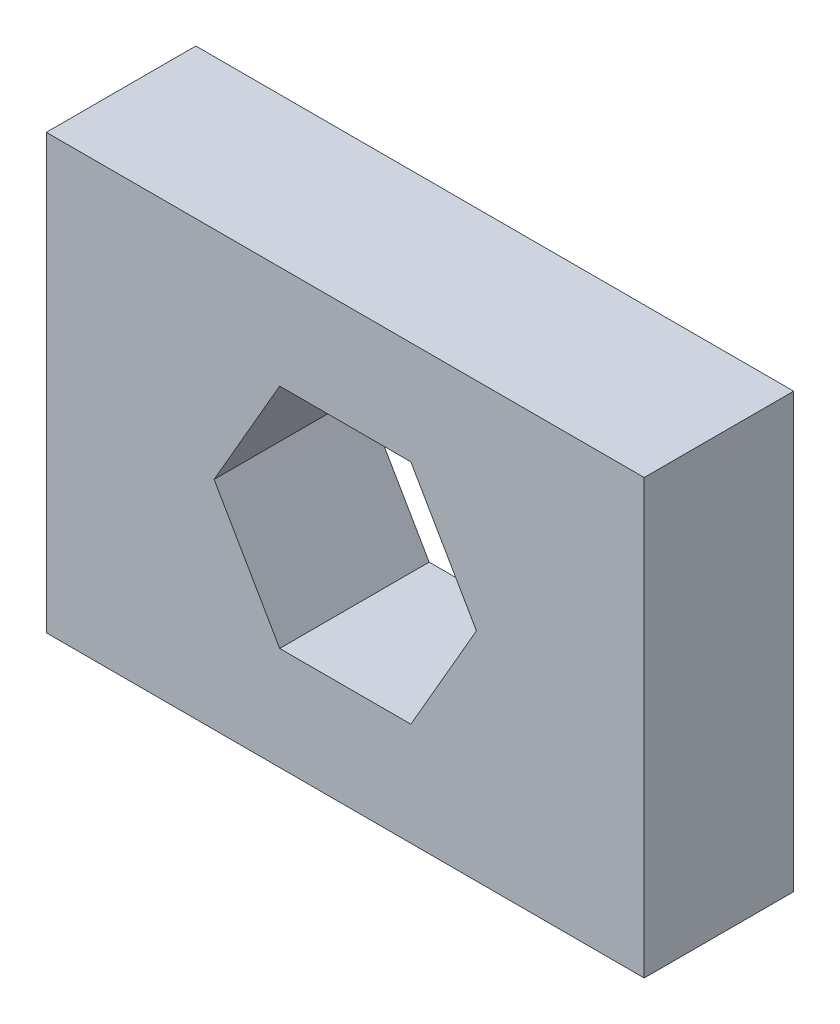
ISO-10303-21;
HEADER;
FILE_DESCRIPTION(('STEP AP214'),'2;1');
FILE_NAME('part.step','',(''),(''),'','','');
FILE_SCHEMA(('AUTOMOTIVE_DESIGN { 1 0 10303 214 1 1 1 1 }'));
ENDSEC;
DATA;
#1=APPLICATION_CONTEXT('core data for automotive mechanical design processes');
#2=APPLICATION_PROTOCOL_DEFINITION('international standard','automotive_design',2000,#1);
#3=PRODUCT_CONTEXT('',#1,'mechanical');
#4=PRODUCT('Part','Part','',(#3));
#5=PRODUCT_RELATED_PRODUCT_CATEGORY('part','',(#4));
#6=PRODUCT_DEFINITION_FORMATION('','',#4);
#7=PRODUCT_DEFINITION_CONTEXT('part definition',#1,'design');
#8=PRODUCT_DEFINITION('design','',#6,#7);
#9=PRODUCT_DEFINITION_SHAPE('','',#8);
#10=(LENGTH_UNIT() NAMED_UNIT(*) SI_UNIT(.MILLI.,.METRE.));
#11=(NAMED_UNIT(*) PLANE_ANGLE_UNIT() SI_UNIT($,.RADIAN.));
#12=(NAMED_UNIT(*) SI_UNIT($,.STERADIAN.) SOLID_ANGLE_UNIT());
#13=UNCERTAINTY_MEASURE_WITH_UNIT(LENGTH_MEASURE(1.E-05),#10,'distance_accuracy_value','');
#14=(GEOMETRIC_REPRESENTATION_CONTEXT(3) GLOBAL_UNCERTAINTY_ASSIGNED_CONTEXT((#13)) GLOBAL_UNIT_ASSIGNED_CONTEXT((#10,
#11,#12)) REPRESENTATION_CONTEXT('',''));
#15=CARTESIAN_POINT('',(0.,0.,0.));
#16=DIRECTION('',(0.,0.,1.));
#17=DIRECTION('',(1.,0.,0.));
#18=AXIS2_PLACEMENT_3D('',#15,#16,#17);
#19=CARTESIAN_POINT('',(0.,0.,5.));
#20=DIRECTION('',(0.,0.,-1.));
#21=DIRECTION('',(-1.,0.,0.));
#22=AXIS2_PLACEMENT_3D('',#19,#20,#21);
#23=PLANE('',#22);
#24=DIRECTION('',(0.,-1.,0.));
#25=VECTOR('',#24,1.);
#26=CARTESIAN_POINT('',(0.,0.,5.));
#27=LINE('',#26,#25);
#28=CARTESIAN_POINT('',(0.,14.5,5.));
#29=VERTEX_POINT('',#28);
#30=CARTESIAN_POINT('',(0.,0.,5.));
#31=VERTEX_POINT('',#30);
#32=EDGE_CURVE('E161',#29,#31,#27,.T.);
#33=ORIENTED_EDGE('',*,*,#32,.T.);
#34=DIRECTION('',(1.,0.,0.));
#35=VECTOR('',#34,1.);
#36=CARTESIAN_POINT('',(0.,0.,5.));
#37=LINE('',#36,#35);
#38=CARTESIAN_POINT('',(20.,0.,5.));
#39=VERTEX_POINT('',#38);
#40=EDGE_CURVE('E164',#31,#39,#37,.T.);
#41=ORIENTED_EDGE('',*,*,#40,.T.);
#42=DIRECTION('',(0.,1.,0.));
#43=VECTOR('',#42,1.);
#44=CARTESIAN_POINT('',(20.,0.,5.));
#45=LINE('',#44,#43);
#46=CARTESIAN_POINT('',(20.,14.5,5.));
#47=VERTEX_POINT('',#46);
#48=EDGE_CURVE('E167',#39,#47,#45,.T.);
#49=ORIENTED_EDGE('',*,*,#48,.T.);
#50=DIRECTION('',(-1.,0.,0.));
#51=VECTOR('',#50,1.);
#52=CARTESIAN_POINT('',(0.,14.5,5.));
#53=LINE('',#52,#51);
#54=EDGE_CURVE('E169',#47,#29,#53,.T.);
#55=ORIENTED_EDGE('',*,*,#54,.T.);
#56=EDGE_LOOP('',(#33,#41,#49,#55));
#57=FACE_BOUND('',#56,.T.);
#58=DIRECTION('',(0.5,0.866025403784439,0.));
#59=VECTOR('',#58,1.);
#60=CARTESIAN_POINT('',(12.1939310229206,3.45,5.));
#61=LINE('',#60,#59);
#62=CARTESIAN_POINT('',(12.1939310229206,3.45,5.));
#63=VERTEX_POINT('',#62);
#64=CARTESIAN_POINT('',(14.3878620458412,7.25,5.));
#65=VERTEX_POINT('',#64);
#66=EDGE_CURVE('E110',#63,#65,#61,.T.);
#67=ORIENTED_EDGE('',*,*,#66,.F.);
#68=DIRECTION('',(1.,0.,0.));
#69=VECTOR('',#68,1.);
#70=CARTESIAN_POINT('',(7.80606897707942,3.45,5.));
#71=LINE('',#70,#69);
#72=CARTESIAN_POINT('',(7.80606897707942,3.45,5.));
#73=VERTEX_POINT('',#72);
#74=EDGE_CURVE('E139',#73,#63,#71,.T.);
#75=ORIENTED_EDGE('',*,*,#74,.F.);
#76=DIRECTION('',(0.5,-0.866025403784439,0.));
#77=VECTOR('',#76,1.);
#78=CARTESIAN_POINT('',(5.61213795415884,7.25,5.));
#79=LINE('',#78,#77);
#80=CARTESIAN_POINT('',(5.61213795415884,7.25,5.));
#81=VERTEX_POINT('',#80);
#82=EDGE_CURVE('E137',#81,#73,#79,.T.);
#83=ORIENTED_EDGE('',*,*,#82,.F.);
#84=DIRECTION('',(-0.5,-0.866025403784439,0.));
#85=VECTOR('',#84,1.);
#86=CARTESIAN_POINT('',(7.80606897707942,11.05,5.));
#87=LINE('',#86,#85);
#88=CARTESIAN_POINT('',(7.80606897707942,11.05,5.));
#89=VERTEX_POINT('',#88);
#90=EDGE_CURVE('E133',#89,#81,#87,.T.);
#91=ORIENTED_EDGE('',*,*,#90,.F.);
#92=DIRECTION('',(-1.,0.,0.));
#93=VECTOR('',#92,1.);
#94=CARTESIAN_POINT('',(12.1939310229206,11.05,5.));
#95=LINE('',#94,#93);
#96=CARTESIAN_POINT('',(12.1939310229206,11.05,5.));
#97=VERTEX_POINT('',#96);
#98=EDGE_CURVE('E131',#97,#89,#95,.T.);
#99=ORIENTED_EDGE('',*,*,#98,.F.);
#100=DIRECTION('',(-0.5,0.866025403784439,0.));
#101=VECTOR('',#100,1.);
#102=CARTESIAN_POINT('',(14.3878620458412,7.25,5.));
#103=LINE('',#102,#101);
#104=EDGE_CURVE('E118',#65,#97,#103,.T.);
#105=ORIENTED_EDGE('',*,*,#104,.F.);
#106=EDGE_LOOP('',(#67,#75,#83,#91,#99,#105));
#107=FACE_BOUND('',#106,.T.);
#108=ADVANCED_FACE('F33',(#57,#107),#23,.F.);
#109=CARTESIAN_POINT('',(0.,0.,0.));
#110=DIRECTION('',(0.,0.,-1.));
#111=DIRECTION('',(-1.,0.,0.));
#112=AXIS2_PLACEMENT_3D('',#109,#110,#111);
#113=PLANE('',#112);
#114=DIRECTION('',(0.,-1.,0.));
#115=VECTOR('',#114,1.);
#116=CARTESIAN_POINT('',(0.,0.,0.));
#117=LINE('',#116,#115);
#118=CARTESIAN_POINT('',(0.,14.5,0.));
#119=VERTEX_POINT('',#118);
#120=CARTESIAN_POINT('',(0.,0.,0.));
#121=VERTEX_POINT('',#120);
#122=EDGE_CURVE('E126',#119,#121,#117,.T.);
#123=ORIENTED_EDGE('',*,*,#122,.F.);
#124=DIRECTION('',(-1.,0.,0.));
#125=VECTOR('',#124,1.);
#126=CARTESIAN_POINT('',(0.,14.5,0.));
#127=LINE('',#126,#125);
#128=CARTESIAN_POINT('',(20.,14.5,0.));
#129=VERTEX_POINT('',#128);
#130=EDGE_CURVE('E165',#129,#119,#127,.T.);
#131=ORIENTED_EDGE('',*,*,#130,.F.);
#132=DIRECTION('',(0.,1.,0.));
#133=VECTOR('',#132,1.);
#134=CARTESIAN_POINT('',(20.,0.,0.));
#135=LINE('',#134,#133);
#136=CARTESIAN_POINT('',(20.,0.,0.));
#137=VERTEX_POINT('',#136);
#138=EDGE_CURVE('E176',#137,#129,#135,.T.);
#139=ORIENTED_EDGE('',*,*,#138,.F.);
#140=DIRECTION('',(1.,0.,0.));
#141=VECTOR('',#140,1.);
#142=CARTESIAN_POINT('',(0.,0.,0.));
#143=LINE('',#142,#141);
#144=EDGE_CURVE('E174',#121,#137,#143,.T.);
#145=ORIENTED_EDGE('',*,*,#144,.F.);
#146=EDGE_LOOP('',(#123,#131,#139,#145));
#147=FACE_BOUND('',#146,.T.);
#148=DIRECTION('',(1.,0.,0.));
#149=VECTOR('',#148,1.);
#150=CARTESIAN_POINT('',(7.80606897707942,3.45,0.));
#151=LINE('',#150,#149);
#152=CARTESIAN_POINT('',(7.80606897707942,3.45,0.));
#153=VERTEX_POINT('',#152);
#154=CARTESIAN_POINT('',(12.1939310229206,3.45,0.));
#155=VERTEX_POINT('',#154);
#156=EDGE_CURVE('E119',#153,#155,#151,.T.);
#157=ORIENTED_EDGE('',*,*,#156,.T.);
#158=DIRECTION('',(0.5,0.866025403784439,0.));
#159=VECTOR('',#158,1.);
#160=CARTESIAN_POINT('',(12.1939310229206,3.45,0.));
#161=LINE('',#160,#159);
#162=CARTESIAN_POINT('',(14.3878620458412,7.25,0.));
#163=VERTEX_POINT('',#162);
#164=EDGE_CURVE('E56',#155,#163,#161,.T.);
#165=ORIENTED_EDGE('',*,*,#164,.T.);
#166=DIRECTION('',(-0.5,0.866025403784439,0.));
#167=VECTOR('',#166,1.);
#168=CARTESIAN_POINT('',(14.3878620458412,7.25,0.));
#169=LINE('',#168,#167);
#170=CARTESIAN_POINT('',(12.1939310229206,11.05,0.));
#171=VERTEX_POINT('',#170);
#172=EDGE_CURVE('E125',#163,#171,#169,.T.);
#173=ORIENTED_EDGE('',*,*,#172,.T.);
#174=DIRECTION('',(-1.,0.,0.));
#175=VECTOR('',#174,1.);
#176=CARTESIAN_POINT('',(12.1939310229206,11.05,0.));
#177=LINE('',#176,#175);
#178=CARTESIAN_POINT('',(7.80606897707942,11.05,0.));
#179=VERTEX_POINT('',#178);
#180=EDGE_CURVE('E143',#171,#179,#177,.T.);
#181=ORIENTED_EDGE('',*,*,#180,.T.);
#182=DIRECTION('',(-0.5,-0.866025403784439,0.));
#183=VECTOR('',#182,1.);
#184=CARTESIAN_POINT('',(7.80606897707942,11.05,0.));
#185=LINE('',#184,#183);
#186=CARTESIAN_POINT('',(5.61213795415884,7.25,0.));
#187=VERTEX_POINT('',#186);
#188=EDGE_CURVE('E146',#179,#187,#185,.T.);
#189=ORIENTED_EDGE('',*,*,#188,.T.);
#190=DIRECTION('',(0.5,-0.866025403784439,0.));
#191=VECTOR('',#190,1.);
#192=CARTESIAN_POINT('',(5.61213795415884,7.25,0.));
#193=LINE('',#192,#191);
#194=EDGE_CURVE('E149',#187,#153,#193,.T.);
#195=ORIENTED_EDGE('',*,*,#194,.T.);
#196=EDGE_LOOP('',(#157,#165,#173,#181,#189,#195));
#197=FACE_BOUND('',#196,.T.);
#198=ADVANCED_FACE('F194',(#147,#197),#113,.T.);
#199=CARTESIAN_POINT('',(0.,0.,5.));
#200=DIRECTION('',(1.,0.,0.));
#201=DIRECTION('',(0.,1.,0.));
#202=AXIS2_PLACEMENT_3D('',#199,#200,#201);
#203=PLANE('',#202);
#204=ORIENTED_EDGE('',*,*,#122,.T.);
#205=DIRECTION('',(0.,0.,-1.));
#206=VECTOR('',#205,1.);
#207=CARTESIAN_POINT('',(0.,0.,5.));
#208=LINE('',#207,#206);
#209=EDGE_CURVE('E11',#31,#121,#208,.T.);
#210=ORIENTED_EDGE('',*,*,#209,.F.);
#211=ORIENTED_EDGE('',*,*,#32,.F.);
#212=DIRECTION('',(0.,0.,-1.));
#213=VECTOR('',#212,1.);
#214=CARTESIAN_POINT('',(0.,14.5,5.));
#215=LINE('',#214,#213);
#216=EDGE_CURVE('E171',#29,#119,#215,.T.);
#217=ORIENTED_EDGE('',*,*,#216,.T.);
#218=EDGE_LOOP('',(#204,#210,#211,#217));
#219=FACE_BOUND('',#218,.T.);
#220=ADVANCED_FACE('F35',(#219),#203,.F.);
#221=CARTESIAN_POINT('',(0.,0.,5.));
#222=DIRECTION('',(0.,1.,0.));
#223=DIRECTION('',(-1.,0.,0.));
#224=AXIS2_PLACEMENT_3D('',#221,#222,#223);
#225=PLANE('',#224);
#226=ORIENTED_EDGE('',*,*,#144,.T.);
#227=DIRECTION('',(0.,0.,-1.));
#228=VECTOR('',#227,1.);
#229=CARTESIAN_POINT('',(20.,0.,5.));
#230=LINE('',#229,#228);
#231=EDGE_CURVE('E41',#39,#137,#230,.T.);
#232=ORIENTED_EDGE('',*,*,#231,.F.);
#233=ORIENTED_EDGE('',*,*,#40,.F.);
#234=ORIENTED_EDGE('',*,*,#209,.T.);
#235=EDGE_LOOP('',(#226,#232,#233,#234));
#236=FACE_BOUND('',#235,.T.);
#237=ADVANCED_FACE('F204',(#236),#225,.F.);
#238=CARTESIAN_POINT('',(20.,0.,5.));
#239=DIRECTION('',(-1.,0.,0.));
#240=DIRECTION('',(0.,0.,1.));
#241=AXIS2_PLACEMENT_3D('',#238,#239,#240);
#242=PLANE('',#241);
#243=ORIENTED_EDGE('',*,*,#138,.T.);
#244=DIRECTION('',(0.,0.,-1.));
#245=VECTOR('',#244,1.);
#246=CARTESIAN_POINT('',(20.,14.5,5.));
#247=LINE('',#246,#245);
#248=EDGE_CURVE('E181',#47,#129,#247,.T.);
#249=ORIENTED_EDGE('',*,*,#248,.F.);
#250=ORIENTED_EDGE('',*,*,#48,.F.);
#251=ORIENTED_EDGE('',*,*,#231,.T.);
#252=EDGE_LOOP('',(#243,#249,#250,#251));
#253=FACE_BOUND('',#252,.T.);
#254=ADVANCED_FACE('F188',(#253),#242,.F.);
#255=CARTESIAN_POINT('',(0.,14.5,5.));
#256=DIRECTION('',(0.,-1.,0.));
#257=DIRECTION('',(0.,0.,-1.));
#258=AXIS2_PLACEMENT_3D('',#255,#256,#257);
#259=PLANE('',#258);
#260=ORIENTED_EDGE('',*,*,#130,.T.);
#261=ORIENTED_EDGE('',*,*,#216,.F.);
#262=ORIENTED_EDGE('',*,*,#54,.F.);
#263=ORIENTED_EDGE('',*,*,#248,.T.);
#264=EDGE_LOOP('',(#260,#261,#262,#263));
#265=FACE_BOUND('',#264,.T.);
#266=ADVANCED_FACE('F198',(#265),#259,.F.);
#267=CARTESIAN_POINT('',(12.1939310229206,3.45,5.));
#268=DIRECTION('',(-0.866025403784439,0.5,0.));
#269=DIRECTION('',(-0.5,-0.866025403784439,0.));
#270=AXIS2_PLACEMENT_3D('',#267,#268,#269);
#271=PLANE('',#270);
#272=ORIENTED_EDGE('',*,*,#164,.F.);
#273=DIRECTION('',(0.,0.,-1.));
#274=VECTOR('',#273,1.);
#275=CARTESIAN_POINT('',(12.1939310229206,3.45,5.));
#276=LINE('',#275,#274);
#277=EDGE_CURVE('E114',#63,#155,#276,.T.);
#278=ORIENTED_EDGE('',*,*,#277,.F.);
#279=ORIENTED_EDGE('',*,*,#66,.T.);
#280=DIRECTION('',(0.,0.,-1.));
#281=VECTOR('',#280,1.);
#282=CARTESIAN_POINT('',(14.3878620458412,7.25,5.));
#283=LINE('',#282,#281);
#284=EDGE_CURVE('E113',#65,#163,#283,.T.);
#285=ORIENTED_EDGE('',*,*,#284,.T.);
#286=EDGE_LOOP('',(#272,#278,#279,#285));
#287=FACE_BOUND('',#286,.T.);
#288=ADVANCED_FACE('F112',(#287),#271,.T.);
#289=CARTESIAN_POINT('',(14.3878620458412,7.25,5.));
#290=DIRECTION('',(-0.866025403784439,-0.5,0.));
#291=DIRECTION('',(0.5,-0.866025403784439,0.));
#292=AXIS2_PLACEMENT_3D('',#289,#290,#291);
#293=PLANE('',#292);
#294=ORIENTED_EDGE('',*,*,#172,.F.);
#295=ORIENTED_EDGE('',*,*,#284,.F.);
#296=ORIENTED_EDGE('',*,*,#104,.T.);
#297=DIRECTION('',(0.,0.,-1.));
#298=VECTOR('',#297,1.);
#299=CARTESIAN_POINT('',(12.1939310229206,11.05,5.));
#300=LINE('',#299,#298);
#301=EDGE_CURVE('E127',#97,#171,#300,.T.);
#302=ORIENTED_EDGE('',*,*,#301,.T.);
#303=EDGE_LOOP('',(#294,#295,#296,#302));
#304=FACE_BOUND('',#303,.T.);
#305=ADVANCED_FACE('F122',(#304),#293,.T.);
#306=CARTESIAN_POINT('',(12.1939310229206,11.05,5.));
#307=DIRECTION('',(0.,-1.,0.));
#308=DIRECTION('',(0.,0.,-1.));
#309=AXIS2_PLACEMENT_3D('',#306,#307,#308);
#310=PLANE('',#309);
#311=ORIENTED_EDGE('',*,*,#180,.F.);
#312=ORIENTED_EDGE('',*,*,#301,.F.);
#313=ORIENTED_EDGE('',*,*,#98,.T.);
#314=DIRECTION('',(0.,0.,-1.));
#315=VECTOR('',#314,1.);
#316=CARTESIAN_POINT('',(7.80606897707942,11.05,5.));
#317=LINE('',#316,#315);
#318=EDGE_CURVE('E158',#89,#179,#317,.T.);
#319=ORIENTED_EDGE('',*,*,#318,.T.);
#320=EDGE_LOOP('',(#311,#312,#313,#319));
#321=FACE_BOUND('',#320,.T.);
#322=ADVANCED_FACE('F227',(#321),#310,.T.);
#323=CARTESIAN_POINT('',(7.80606897707942,11.05,5.));
#324=DIRECTION('',(0.866025403784439,-0.5,0.));
#325=DIRECTION('',(0.5,0.866025403784439,0.));
#326=AXIS2_PLACEMENT_3D('',#323,#324,#325);
#327=PLANE('',#326);
#328=ORIENTED_EDGE('',*,*,#188,.F.);
#329=ORIENTED_EDGE('',*,*,#318,.F.);
#330=ORIENTED_EDGE('',*,*,#90,.T.);
#331=DIRECTION('',(0.,0.,-1.));
#332=VECTOR('',#331,1.);
#333=CARTESIAN_POINT('',(5.61213795415884,7.25,5.));
#334=LINE('',#333,#332);
#335=EDGE_CURVE('E156',#81,#187,#334,.T.);
#336=ORIENTED_EDGE('',*,*,#335,.T.);
#337=EDGE_LOOP('',(#328,#329,#330,#336));
#338=FACE_BOUND('',#337,.T.);
#339=ADVANCED_FACE('F231',(#338),#327,.T.);
#340=CARTESIAN_POINT('',(5.61213795415884,7.25,5.));
#341=DIRECTION('',(0.866025403784439,0.5,0.));
#342=DIRECTION('',(-0.5,0.866025403784439,0.));
#343=AXIS2_PLACEMENT_3D('',#340,#341,#342);
#344=PLANE('',#343);
#345=ORIENTED_EDGE('',*,*,#194,.F.);
#346=ORIENTED_EDGE('',*,*,#335,.F.);
#347=ORIENTED_EDGE('',*,*,#82,.T.);
#348=DIRECTION('',(0.,0.,-1.));
#349=VECTOR('',#348,1.);
#350=CARTESIAN_POINT('',(7.80606897707942,3.45,5.));
#351=LINE('',#350,#349);
#352=EDGE_CURVE('E48',#73,#153,#351,.T.);
#353=ORIENTED_EDGE('',*,*,#352,.T.);
#354=EDGE_LOOP('',(#345,#346,#347,#353));
#355=FACE_BOUND('',#354,.T.);
#356=ADVANCED_FACE('F237',(#355),#344,.T.);
#357=CARTESIAN_POINT('',(7.80606897707942,3.45,5.));
#358=DIRECTION('',(0.,1.,0.));
#359=DIRECTION('',(-1.,0.,0.));
#360=AXIS2_PLACEMENT_3D('',#357,#358,#359);
#361=PLANE('',#360);
#362=ORIENTED_EDGE('',*,*,#156,.F.);
#363=ORIENTED_EDGE('',*,*,#352,.F.);
#364=ORIENTED_EDGE('',*,*,#74,.T.);
#365=ORIENTED_EDGE('',*,*,#277,.T.);
#366=EDGE_LOOP('',(#362,#363,#364,#365));
#367=FACE_BOUND('',#366,.T.);
#368=ADVANCED_FACE('F241',(#367),#361,.T.);
#369=CLOSED_SHELL('',(#108,#198,#220,#237,#254,#266,#288,#305,#322,#339,#356,#368));
#370=MANIFOLD_SOLID_BREP('B2',#369);
#371=ADVANCED_BREP_SHAPE_REPRESENTATION('',(#18,#370),#14);
#372=SHAPE_DEFINITION_REPRESENTATION(#9,#371);
ENDSEC;
END-ISO-10303-21;
